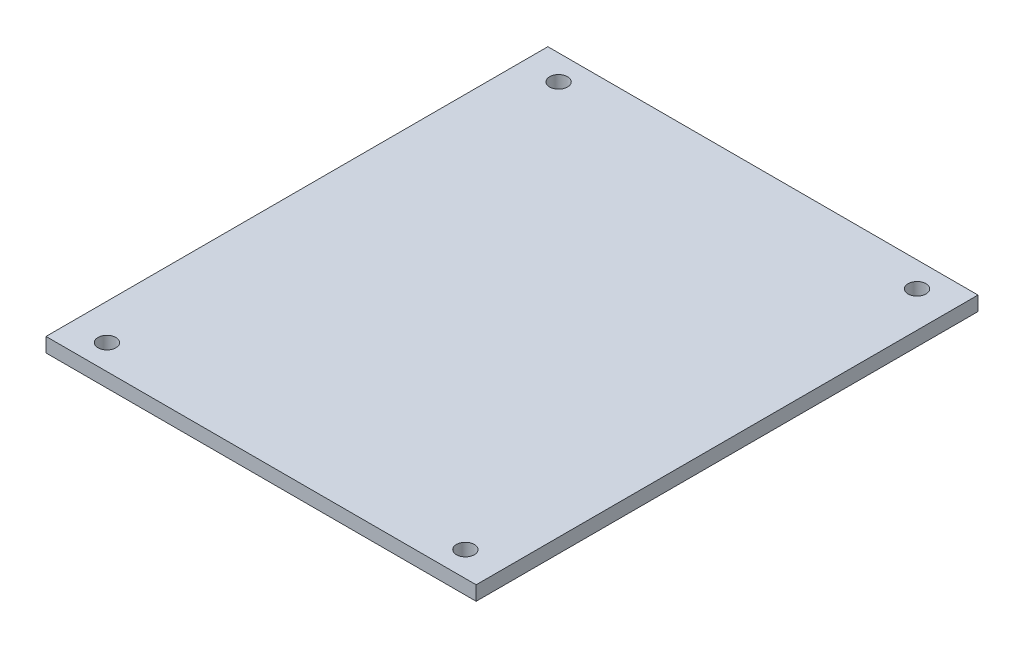
ISO-10303-21;
HEADER;
FILE_DESCRIPTION(('STEP AP214'),'2;1');
FILE_NAME('part.step','',(''),(''),'','','');
FILE_SCHEMA(('AUTOMOTIVE_DESIGN { 1 0 10303 214 1 1 1 1 }'));
ENDSEC;
DATA;
#1=APPLICATION_CONTEXT('core data for automotive mechanical design processes');
#2=APPLICATION_PROTOCOL_DEFINITION('international standard','automotive_design',2000,#1);
#3=PRODUCT_CONTEXT('',#1,'mechanical');
#4=PRODUCT('Part','Part','',(#3));
#5=PRODUCT_RELATED_PRODUCT_CATEGORY('part','',(#4));
#6=PRODUCT_DEFINITION_FORMATION('','',#4);
#7=PRODUCT_DEFINITION_CONTEXT('part definition',#1,'design');
#8=PRODUCT_DEFINITION('design','',#6,#7);
#9=PRODUCT_DEFINITION_SHAPE('','',#8);
#10=(LENGTH_UNIT() NAMED_UNIT(*) SI_UNIT(.MILLI.,.METRE.));
#11=(NAMED_UNIT(*) PLANE_ANGLE_UNIT() SI_UNIT($,.RADIAN.));
#12=(NAMED_UNIT(*) SI_UNIT($,.STERADIAN.) SOLID_ANGLE_UNIT());
#13=UNCERTAINTY_MEASURE_WITH_UNIT(LENGTH_MEASURE(1.E-05),#10,'distance_accuracy_value','');
#14=(GEOMETRIC_REPRESENTATION_CONTEXT(3) GLOBAL_UNCERTAINTY_ASSIGNED_CONTEXT((#13)) GLOBAL_UNIT_ASSIGNED_CONTEXT((#10,
#11,#12)) REPRESENTATION_CONTEXT('',''));
#15=CARTESIAN_POINT('',(0.,0.,0.));
#16=DIRECTION('',(0.,0.,1.));
#17=DIRECTION('',(1.,0.,0.));
#18=AXIS2_PLACEMENT_3D('',#15,#16,#17);
#19=CARTESIAN_POINT('',(60.,4.,70.));
#20=DIRECTION('',(-1.,0.,0.));
#21=DIRECTION('',(0.,0.,1.));
#22=AXIS2_PLACEMENT_3D('',#19,#20,#21);
#23=PLANE('',#22);
#24=DIRECTION('',(0.,0.,-1.));
#25=VECTOR('',#24,1.);
#26=CARTESIAN_POINT('',(60.,0.,70.));
#27=LINE('',#26,#25);
#28=CARTESIAN_POINT('',(60.,0.,70.));
#29=VERTEX_POINT('',#28);
#30=CARTESIAN_POINT('',(60.,0.,-70.));
#31=VERTEX_POINT('',#30);
#32=EDGE_CURVE('E107',#29,#31,#27,.T.);
#33=ORIENTED_EDGE('',*,*,#32,.T.);
#34=DIRECTION('',(0.,-1.,0.));
#35=VECTOR('',#34,1.);
#36=CARTESIAN_POINT('',(60.,4.,-70.));
#37=LINE('',#36,#35);
#38=CARTESIAN_POINT('',(60.,4.,-70.));
#39=VERTEX_POINT('',#38);
#40=EDGE_CURVE('E11',#39,#31,#37,.T.);
#41=ORIENTED_EDGE('',*,*,#40,.F.);
#42=DIRECTION('',(0.,0.,-1.));
#43=VECTOR('',#42,1.);
#44=CARTESIAN_POINT('',(60.,4.,70.));
#45=LINE('',#44,#43);
#46=CARTESIAN_POINT('',(60.,4.,70.));
#47=VERTEX_POINT('',#46);
#48=EDGE_CURVE('E91',#47,#39,#45,.T.);
#49=ORIENTED_EDGE('',*,*,#48,.F.);
#50=DIRECTION('',(0.,-1.,0.));
#51=VECTOR('',#50,1.);
#52=CARTESIAN_POINT('',(60.,4.,70.));
#53=LINE('',#52,#51);
#54=EDGE_CURVE('E103',#47,#29,#53,.T.);
#55=ORIENTED_EDGE('',*,*,#54,.T.);
#56=EDGE_LOOP('',(#33,#41,#49,#55));
#57=FACE_BOUND('',#56,.T.);
#58=ADVANCED_FACE('F39',(#57),#23,.F.);
#59=CARTESIAN_POINT('',(-60.,4.,-70.));
#60=DIRECTION('',(0.,0.,1.));
#61=DIRECTION('',(1.,0.,0.));
#62=AXIS2_PLACEMENT_3D('',#59,#60,#61);
#63=PLANE('',#62);
#64=DIRECTION('',(-1.,0.,0.));
#65=VECTOR('',#64,1.);
#66=CARTESIAN_POINT('',(-60.,0.,-70.));
#67=LINE('',#66,#65);
#68=CARTESIAN_POINT('',(-60.,0.,-70.));
#69=VERTEX_POINT('',#68);
#70=EDGE_CURVE('E96',#31,#69,#67,.T.);
#71=ORIENTED_EDGE('',*,*,#70,.T.);
#72=DIRECTION('',(0.,-1.,0.));
#73=VECTOR('',#72,1.);
#74=CARTESIAN_POINT('',(-60.,4.,-70.));
#75=LINE('',#74,#73);
#76=CARTESIAN_POINT('',(-60.,4.,-70.));
#77=VERTEX_POINT('',#76);
#78=EDGE_CURVE('E48',#77,#69,#75,.T.);
#79=ORIENTED_EDGE('',*,*,#78,.F.);
#80=DIRECTION('',(-1.,0.,0.));
#81=VECTOR('',#80,1.);
#82=CARTESIAN_POINT('',(-60.,4.,-70.));
#83=LINE('',#82,#81);
#84=EDGE_CURVE('E86',#39,#77,#83,.T.);
#85=ORIENTED_EDGE('',*,*,#84,.F.);
#86=ORIENTED_EDGE('',*,*,#40,.T.);
#87=EDGE_LOOP('',(#71,#79,#85,#86));
#88=FACE_BOUND('',#87,.T.);
#89=ADVANCED_FACE('F95',(#88),#63,.F.);
#90=CARTESIAN_POINT('',(-60.,4.,70.));
#91=DIRECTION('',(1.,0.,0.));
#92=DIRECTION('',(0.,0.,-1.));
#93=AXIS2_PLACEMENT_3D('',#90,#91,#92);
#94=PLANE('',#93);
#95=DIRECTION('',(0.,0.,1.));
#96=VECTOR('',#95,1.);
#97=CARTESIAN_POINT('',(-60.,0.,70.));
#98=LINE('',#97,#96);
#99=CARTESIAN_POINT('',(-60.,0.,70.));
#100=VERTEX_POINT('',#99);
#101=EDGE_CURVE('E73',#69,#100,#98,.T.);
#102=ORIENTED_EDGE('',*,*,#101,.T.);
#103=DIRECTION('',(0.,-1.,0.));
#104=VECTOR('',#103,1.);
#105=CARTESIAN_POINT('',(-60.,4.,70.));
#106=LINE('',#105,#104);
#107=CARTESIAN_POINT('',(-60.,4.,70.));
#108=VERTEX_POINT('',#107);
#109=EDGE_CURVE('E98',#108,#100,#106,.T.);
#110=ORIENTED_EDGE('',*,*,#109,.F.);
#111=DIRECTION('',(0.,0.,1.));
#112=VECTOR('',#111,1.);
#113=CARTESIAN_POINT('',(-60.,4.,70.));
#114=LINE('',#113,#112);
#115=EDGE_CURVE('E89',#77,#108,#114,.T.);
#116=ORIENTED_EDGE('',*,*,#115,.F.);
#117=ORIENTED_EDGE('',*,*,#78,.T.);
#118=EDGE_LOOP('',(#102,#110,#116,#117));
#119=FACE_BOUND('',#118,.T.);
#120=ADVANCED_FACE('F99',(#119),#94,.F.);
#121=CARTESIAN_POINT('',(-60.,4.,70.));
#122=DIRECTION('',(0.,0.,-1.));
#123=DIRECTION('',(-1.,0.,0.));
#124=AXIS2_PLACEMENT_3D('',#121,#122,#123);
#125=PLANE('',#124);
#126=DIRECTION('',(1.,0.,0.));
#127=VECTOR('',#126,1.);
#128=CARTESIAN_POINT('',(-60.,0.,70.));
#129=LINE('',#128,#127);
#130=EDGE_CURVE('E79',#100,#29,#129,.T.);
#131=ORIENTED_EDGE('',*,*,#130,.T.);
#132=ORIENTED_EDGE('',*,*,#54,.F.);
#133=DIRECTION('',(1.,0.,0.));
#134=VECTOR('',#133,1.);
#135=CARTESIAN_POINT('',(-60.,4.,70.));
#136=LINE('',#135,#134);
#137=EDGE_CURVE('E56',#108,#47,#136,.T.);
#138=ORIENTED_EDGE('',*,*,#137,.F.);
#139=ORIENTED_EDGE('',*,*,#109,.T.);
#140=EDGE_LOOP('',(#131,#132,#138,#139));
#141=FACE_BOUND('',#140,.T.);
#142=ADVANCED_FACE('F121',(#141),#125,.F.);
#143=CARTESIAN_POINT('',(0.,4.,0.));
#144=DIRECTION('',(0.,-1.,0.));
#145=DIRECTION('',(0.,0.,-1.));
#146=AXIS2_PLACEMENT_3D('',#143,#144,#145);
#147=PLANE('',#146);
#148=CARTESIAN_POINT('',(50.,4.,-63.));
#149=DIRECTION('',(0.,1.,0.));
#150=DIRECTION('',(0.,0.,1.));
#151=AXIS2_PLACEMENT_3D('',#148,#149,#150);
#152=CIRCLE('',#151,2.5);
#153=CARTESIAN_POINT('',(50.,4.,-60.5));
#154=VERTEX_POINT('',#153);
#155=EDGE_CURVE('E132',#154,#154,#152,.T.);
#156=ORIENTED_EDGE('',*,*,#155,.F.);
#157=EDGE_LOOP('',(#156));
#158=FACE_BOUND('',#157,.T.);
#159=CARTESIAN_POINT('',(-50.,4.,63.));
#160=DIRECTION('',(0.,1.,0.));
#161=DIRECTION('',(0.,0.,1.));
#162=AXIS2_PLACEMENT_3D('',#159,#160,#161);
#163=CIRCLE('',#162,2.5);
#164=CARTESIAN_POINT('',(-50.,4.,65.5));
#165=VERTEX_POINT('',#164);
#166=EDGE_CURVE('E140',#165,#165,#163,.T.);
#167=ORIENTED_EDGE('',*,*,#166,.F.);
#168=EDGE_LOOP('',(#167));
#169=FACE_BOUND('',#168,.T.);
#170=CARTESIAN_POINT('',(50.,4.,63.));
#171=DIRECTION('',(0.,1.,0.));
#172=DIRECTION('',(0.,0.,1.));
#173=AXIS2_PLACEMENT_3D('',#170,#171,#172);
#174=CIRCLE('',#173,2.5);
#175=CARTESIAN_POINT('',(50.,4.,65.5));
#176=VERTEX_POINT('',#175);
#177=EDGE_CURVE('E141',#176,#176,#174,.T.);
#178=ORIENTED_EDGE('',*,*,#177,.F.);
#179=EDGE_LOOP('',(#178));
#180=FACE_BOUND('',#179,.T.);
#181=CARTESIAN_POINT('',(-50.,4.,-63.));
#182=DIRECTION('',(0.,1.,0.));
#183=DIRECTION('',(0.,0.,1.));
#184=AXIS2_PLACEMENT_3D('',#181,#182,#183);
#185=CIRCLE('',#184,2.5);
#186=CARTESIAN_POINT('',(-50.,4.,-60.5));
#187=VERTEX_POINT('',#186);
#188=EDGE_CURVE('E128',#187,#187,#185,.T.);
#189=ORIENTED_EDGE('',*,*,#188,.F.);
#190=EDGE_LOOP('',(#189));
#191=FACE_BOUND('',#190,.T.);
#192=ORIENTED_EDGE('',*,*,#48,.T.);
#193=ORIENTED_EDGE('',*,*,#84,.T.);
#194=ORIENTED_EDGE('',*,*,#115,.T.);
#195=ORIENTED_EDGE('',*,*,#137,.T.);
#196=EDGE_LOOP('',(#192,#193,#194,#195));
#197=FACE_BOUND('',#196,.T.);
#198=ADVANCED_FACE('F87',(#158,#169,#180,#191,#197),#147,.F.);
#199=CARTESIAN_POINT('',(0.,0.,0.));
#200=DIRECTION('',(0.,-1.,0.));
#201=DIRECTION('',(0.,0.,-1.));
#202=AXIS2_PLACEMENT_3D('',#199,#200,#201);
#203=PLANE('',#202);
#204=CARTESIAN_POINT('',(50.,0.,-63.));
#205=DIRECTION('',(0.,1.,0.));
#206=DIRECTION('',(0.,0.,1.));
#207=AXIS2_PLACEMENT_3D('',#204,#205,#206);
#208=CIRCLE('',#207,2.5);
#209=CARTESIAN_POINT('',(50.,0.,-60.5));
#210=VERTEX_POINT('',#209);
#211=EDGE_CURVE('E145',#210,#210,#208,.T.);
#212=ORIENTED_EDGE('',*,*,#211,.T.);
#213=EDGE_LOOP('',(#212));
#214=FACE_BOUND('',#213,.T.);
#215=CARTESIAN_POINT('',(-50.,0.,63.));
#216=DIRECTION('',(0.,1.,0.));
#217=DIRECTION('',(0.,0.,1.));
#218=AXIS2_PLACEMENT_3D('',#215,#216,#217);
#219=CIRCLE('',#218,2.5);
#220=CARTESIAN_POINT('',(-50.,0.,65.5));
#221=VERTEX_POINT('',#220);
#222=EDGE_CURVE('E136',#221,#221,#219,.T.);
#223=ORIENTED_EDGE('',*,*,#222,.T.);
#224=EDGE_LOOP('',(#223));
#225=FACE_BOUND('',#224,.T.);
#226=CARTESIAN_POINT('',(50.,0.,63.));
#227=DIRECTION('',(0.,1.,0.));
#228=DIRECTION('',(0.,0.,1.));
#229=AXIS2_PLACEMENT_3D('',#226,#227,#228);
#230=CIRCLE('',#229,2.5);
#231=CARTESIAN_POINT('',(50.,0.,65.5));
#232=VERTEX_POINT('',#231);
#233=EDGE_CURVE('E152',#232,#232,#230,.T.);
#234=ORIENTED_EDGE('',*,*,#233,.T.);
#235=EDGE_LOOP('',(#234));
#236=FACE_BOUND('',#235,.T.);
#237=CARTESIAN_POINT('',(-50.,0.,-63.));
#238=DIRECTION('',(0.,1.,0.));
#239=DIRECTION('',(0.,0.,1.));
#240=AXIS2_PLACEMENT_3D('',#237,#238,#239);
#241=CIRCLE('',#240,2.5);
#242=CARTESIAN_POINT('',(-50.,0.,-60.5));
#243=VERTEX_POINT('',#242);
#244=EDGE_CURVE('E111',#243,#243,#241,.T.);
#245=ORIENTED_EDGE('',*,*,#244,.T.);
#246=EDGE_LOOP('',(#245));
#247=FACE_BOUND('',#246,.T.);
#248=ORIENTED_EDGE('',*,*,#32,.F.);
#249=ORIENTED_EDGE('',*,*,#130,.F.);
#250=ORIENTED_EDGE('',*,*,#101,.F.);
#251=ORIENTED_EDGE('',*,*,#70,.F.);
#252=EDGE_LOOP('',(#248,#249,#250,#251));
#253=FACE_BOUND('',#252,.T.);
#254=ADVANCED_FACE('F124',(#214,#225,#236,#247,#253),#203,.T.);
#255=CARTESIAN_POINT('',(-50.,0.,-63.));
#256=DIRECTION('',(0.,1.,0.));
#257=DIRECTION('',(0.,0.,1.));
#258=AXIS2_PLACEMENT_3D('',#255,#256,#257);
#259=CYLINDRICAL_SURFACE('',#258,2.5);
#260=ORIENTED_EDGE('',*,*,#244,.F.);
#261=EDGE_LOOP('',(#260));
#262=FACE_BOUND('',#261,.T.);
#263=ORIENTED_EDGE('',*,*,#188,.T.);
#264=EDGE_LOOP('',(#263));
#265=FACE_BOUND('',#264,.T.);
#266=ADVANCED_FACE('F168',(#262,#265),#259,.F.);
#267=CARTESIAN_POINT('',(50.,0.,63.));
#268=DIRECTION('',(0.,1.,0.));
#269=DIRECTION('',(0.,0.,1.));
#270=AXIS2_PLACEMENT_3D('',#267,#268,#269);
#271=CYLINDRICAL_SURFACE('',#270,2.5);
#272=ORIENTED_EDGE('',*,*,#233,.F.);
#273=EDGE_LOOP('',(#272));
#274=FACE_BOUND('',#273,.T.);
#275=ORIENTED_EDGE('',*,*,#177,.T.);
#276=EDGE_LOOP('',(#275));
#277=FACE_BOUND('',#276,.T.);
#278=ADVANCED_FACE('F160',(#274,#277),#271,.F.);
#279=CARTESIAN_POINT('',(-50.,0.,63.));
#280=DIRECTION('',(0.,1.,0.));
#281=DIRECTION('',(0.,0.,1.));
#282=AXIS2_PLACEMENT_3D('',#279,#280,#281);
#283=CYLINDRICAL_SURFACE('',#282,2.5);
#284=ORIENTED_EDGE('',*,*,#222,.F.);
#285=EDGE_LOOP('',(#284));
#286=FACE_BOUND('',#285,.T.);
#287=ORIENTED_EDGE('',*,*,#166,.T.);
#288=EDGE_LOOP('',(#287));
#289=FACE_BOUND('',#288,.T.);
#290=ADVANCED_FACE('F176',(#286,#289),#283,.F.);
#291=CARTESIAN_POINT('',(50.,0.,-63.));
#292=DIRECTION('',(0.,1.,0.));
#293=DIRECTION('',(0.,0.,1.));
#294=AXIS2_PLACEMENT_3D('',#291,#292,#293);
#295=CYLINDRICAL_SURFACE('',#294,2.5);
#296=ORIENTED_EDGE('',*,*,#211,.F.);
#297=EDGE_LOOP('',(#296));
#298=FACE_BOUND('',#297,.T.);
#299=ORIENTED_EDGE('',*,*,#155,.T.);
#300=EDGE_LOOP('',(#299));
#301=FACE_BOUND('',#300,.T.);
#302=ADVANCED_FACE('F224',(#298,#301),#295,.F.);
#303=CLOSED_SHELL('',(#58,#89,#120,#142,#198,#254,#266,#278,#290,#302));
#304=MANIFOLD_SOLID_BREP('B2',#303);
#305=ADVANCED_BREP_SHAPE_REPRESENTATION('',(#18,#304),#14);
#306=SHAPE_DEFINITION_REPRESENTATION(#9,#305);
ENDSEC;
END-ISO-10303-21;
